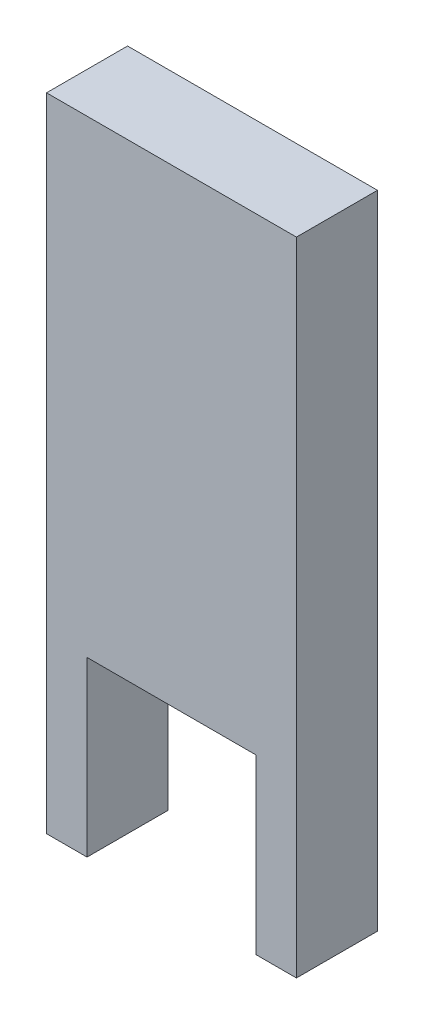
ISO-10303-21;
HEADER;
FILE_DESCRIPTION(('STEP AP214'),'2;1');
FILE_NAME('part.step','',(''),(''),'','','');
FILE_SCHEMA(('AUTOMOTIVE_DESIGN { 1 0 10303 214 1 1 1 1 }'));
ENDSEC;
DATA;
#1=APPLICATION_CONTEXT('core data for automotive mechanical design processes');
#2=APPLICATION_PROTOCOL_DEFINITION('international standard','automotive_design',2000,#1);
#3=PRODUCT_CONTEXT('',#1,'mechanical');
#4=PRODUCT('Part','Part','',(#3));
#5=PRODUCT_RELATED_PRODUCT_CATEGORY('part','',(#4));
#6=PRODUCT_DEFINITION_FORMATION('','',#4);
#7=PRODUCT_DEFINITION_CONTEXT('part definition',#1,'design');
#8=PRODUCT_DEFINITION('design','',#6,#7);
#9=PRODUCT_DEFINITION_SHAPE('','',#8);
#10=(LENGTH_UNIT() NAMED_UNIT(*) SI_UNIT(.MILLI.,.METRE.));
#11=(NAMED_UNIT(*) PLANE_ANGLE_UNIT() SI_UNIT($,.RADIAN.));
#12=(NAMED_UNIT(*) SI_UNIT($,.STERADIAN.) SOLID_ANGLE_UNIT());
#13=UNCERTAINTY_MEASURE_WITH_UNIT(LENGTH_MEASURE(1.E-05),#10,'distance_accuracy_value','');
#14=(GEOMETRIC_REPRESENTATION_CONTEXT(3) GLOBAL_UNCERTAINTY_ASSIGNED_CONTEXT((#13)) GLOBAL_UNIT_ASSIGNED_CONTEXT((#10,
#11,#12)) REPRESENTATION_CONTEXT('',''));
#15=CARTESIAN_POINT('',(0.,0.,0.));
#16=DIRECTION('',(0.,0.,1.));
#17=DIRECTION('',(1.,0.,0.));
#18=AXIS2_PLACEMENT_3D('',#15,#16,#17);
#19=CARTESIAN_POINT('',(-32.6951216622849,-23.8610871004323,2.25355338999986));
#20=DIRECTION('',(1.,0.,0.));
#21=DIRECTION('',(0.,-0.868514733325434,-0.495663351476232));
#22=AXIS2_PLACEMENT_3D('',#19,#20,#21);
#23=CYLINDRICAL_SURFACE('',#22,0.1);
#24=CARTESIAN_POINT('',(-32.6951216622849,-23.7896728161469,2.32355338999985));
#25=CARTESIAN_POINT('',(-32.6951216622849,-23.7777104068749,2.31137912783125));
#26=CARTESIAN_POINT('',(-32.6951216622849,-23.7689641964226,2.29608274833096));
#27=CARTESIAN_POINT('',(-32.6951216622849,-23.7645382938112,2.27959890119473));
#28=(BOUNDED_CURVE() B_SPLINE_CURVE(3,(#24,#25,#26,#27),.UNSPECIFIED.,.F.,
.F.) B_SPLINE_CURVE_WITH_KNOTS((4,4),(0.,0.996703266732082),
.UNSPECIFIED.) CURVE() GEOMETRIC_REPRESENTATION_ITEM() RATIONAL_B_SPLINE_CURVE((1.,1.,1.,1.)) REPRESENTATION_ITEM(''));
#29=CARTESIAN_POINT('',(-32.6951214956182,-23.7896729135874,2.32355330666029));
#30=VERTEX_POINT('',#29);
#31=CARTESIAN_POINT('',(-32.6951216622849,-23.7645372906601,2.27959442029426));
#32=VERTEX_POINT('',#31);
#33=EDGE_CURVE('E11',#30,#32,#28,.T.);
#34=ORIENTED_EDGE('',*,*,#33,.T.);
#35=CARTESIAN_POINT('',(-32.6951216622849,-23.7644945178032,2.27943529450943));
#36=CARTESIAN_POINT('',(-32.6117883289516,-23.7644945178032,2.27943529450943));
#37=CARTESIAN_POINT('',(-32.5284549956182,-23.7644945178032,2.27943529450943));
#38=CARTESIAN_POINT('',(-32.4451216622849,-23.7644945178032,2.27943529450943));
#39=(BOUNDED_CURVE() B_SPLINE_CURVE(3,(#35,#36,#37,#38),.UNSPECIFIED.,.F.,
.F.) B_SPLINE_CURVE_WITH_KNOTS((4,4),(-1.,0.),
.UNSPECIFIED.) CURVE() GEOMETRIC_REPRESENTATION_ITEM() RATIONAL_B_SPLINE_CURVE((1.,1.,1.,1.)) REPRESENTATION_ITEM(''));
#40=CARTESIAN_POINT('',(-32.4451216622849,-23.7645439761128,2.27961932737541));
#41=VERTEX_POINT('',#40);
#42=EDGE_CURVE('E47',#32,#41,#39,.T.);
#43=ORIENTED_EDGE('',*,*,#42,.T.);
#44=CARTESIAN_POINT('',(-32.4451216622849,-23.7645437937707,2.27961937637639));
#45=CARTESIAN_POINT('',(-32.4451216622849,-23.7689714398459,2.29609541496377));
#46=CARTESIAN_POINT('',(-32.4451216622849,-23.7777153600028,2.31138416867851));
#47=CARTESIAN_POINT('',(-32.4451216622849,-23.7896728161469,2.32355338999986));
#48=(BOUNDED_CURVE() B_SPLINE_CURVE(3,(#44,#45,#46,#47),.UNSPECIFIED.,.F.,
.F.) B_SPLINE_CURVE_WITH_KNOTS((4,4),(0.00370942595290715,1.),
.UNSPECIFIED.) CURVE() GEOMETRIC_REPRESENTATION_ITEM() RATIONAL_B_SPLINE_CURVE((1.,1.,1.,1.)) REPRESENTATION_ITEM(''));
#49=CARTESIAN_POINT('',(-32.4451218289516,-23.7896729344209,2.32355330666029));
#50=VERTEX_POINT('',#49);
#51=EDGE_CURVE('E305',#41,#50,#48,.T.);
#52=ORIENTED_EDGE('',*,*,#51,.T.);
#53=CARTESIAN_POINT('',(-32.4451218289516,-23.7896728161469,2.32355338999986));
#54=CARTESIAN_POINT('',(-32.5284550511738,-23.7896728161469,2.32355338999986));
#55=CARTESIAN_POINT('',(-32.611788273396,-23.7896728161469,2.32355338999986));
#56=CARTESIAN_POINT('',(-32.6951214956182,-23.7896728161469,2.32355338999986));
#57=(BOUNDED_CURVE() B_SPLINE_CURVE(3,(#53,#54,#55,#56),.UNSPECIFIED.,.F.,
.F.) B_SPLINE_CURVE_WITH_KNOTS((4,4),(-0.999999333333334,-6.66666666315763E-07),
.UNSPECIFIED.) CURVE() GEOMETRIC_REPRESENTATION_ITEM() RATIONAL_B_SPLINE_CURVE((1.,1.,1.,1.)) REPRESENTATION_ITEM(''));
#58=EDGE_CURVE('E219',#50,#30,#57,.T.);
#59=ORIENTED_EDGE('',*,*,#58,.T.);
#60=EDGE_LOOP('',(#34,#43,#52,#59));
#61=FACE_BOUND('',#60,.T.);
#62=ADVANCED_FACE('F17',(#61),#23,.F.);
#63=CARTESIAN_POINT('',(-32.6951216622849,-22.7947187344132,0.798999999999811));
#64=DIRECTION('',(-1.,0.,0.));
#65=DIRECTION('',(0.,0.,1.));
#66=AXIS2_PLACEMENT_3D('',#63,#64,#65);
#67=PLANE('',#66);
#68=CARTESIAN_POINT('',(-32.6951216622849,-24.0457187344132,2.32355322333319));
#69=CARTESIAN_POINT('',(-32.6951216622849,-24.0457187344132,2.2835533344443));
#70=CARTESIAN_POINT('',(-32.6951216622849,-24.0457187344132,2.24355344555542));
#71=CARTESIAN_POINT('',(-32.6951216622849,-24.0457187344132,2.20355355666653));
#72=(BOUNDED_CURVE() B_SPLINE_CURVE(3,(#68,#69,#70,#71),.UNSPECIFIED.,.F.,
.F.) B_SPLINE_CURVE_WITH_KNOTS((4,4),(-0.999998611111097,-1.38888890984188E-06),
.UNSPECIFIED.) CURVE() GEOMETRIC_REPRESENTATION_ITEM() RATIONAL_B_SPLINE_CURVE((1.,1.,1.,1.)) REPRESENTATION_ITEM(''));
#73=CARTESIAN_POINT('',(-32.6951218289516,-24.0457185677465,2.32355322333319));
#74=VERTEX_POINT('',#73);
#75=CARTESIAN_POINT('',(-32.6951218289516,-24.0457185677465,2.20355355666653));
#76=VERTEX_POINT('',#75);
#77=EDGE_CURVE('E270',#74,#76,#72,.T.);
#78=ORIENTED_EDGE('',*,*,#77,.T.);
#79=CARTESIAN_POINT('',(-32.6951216622849,-24.0457185677465,2.20355338999986));
#80=CARTESIAN_POINT('',(-32.6951216622849,-23.945199790589,2.20355338999986));
#81=CARTESIAN_POINT('',(-32.6951216622849,-23.8446810134315,2.20355338999986));
#82=CARTESIAN_POINT('',(-32.6951216622849,-23.744162236274,2.20355338999986));
#83=(BOUNDED_CURVE() B_SPLINE_CURVE(3,(#79,#80,#81,#82),.UNSPECIFIED.,.F.,
.F.) B_SPLINE_CURVE_WITH_KNOTS((4,4),(-0.999999447312362,-7.08005090614583E-07),
.UNSPECIFIED.) CURVE() GEOMETRIC_REPRESENTATION_ITEM() RATIONAL_B_SPLINE_CURVE((1.,1.,1.,1.)) REPRESENTATION_ITEM(''));
#84=CARTESIAN_POINT('',(-32.6951214956182,-23.744162236274,2.20355355382702));
#85=VERTEX_POINT('',#84);
#86=EDGE_CURVE('E168',#76,#85,#83,.T.);
#87=ORIENTED_EDGE('',*,*,#86,.T.);
#88=CARTESIAN_POINT('',(-32.6951216622849,-23.7441620780291,2.20355359622861));
#89=CARTESIAN_POINT('',(-32.6951216622849,-23.7509395579538,2.22884749565555));
#90=CARTESIAN_POINT('',(-32.6951216622849,-23.7577170378785,2.25414139508249));
#91=CARTESIAN_POINT('',(-32.6951216622849,-23.7644945178032,2.27943529450943));
#92=(BOUNDED_CURVE() B_SPLINE_CURVE(3,(#88,#89,#90,#91),.UNSPECIFIED.,.F.,
.F.) B_SPLINE_CURVE_WITH_KNOTS((4,4),(-0.999997282240848,0.),
.UNSPECIFIED.) CURVE() GEOMETRIC_REPRESENTATION_ITEM() RATIONAL_B_SPLINE_CURVE((1.,1.,1.,1.)) REPRESENTATION_ITEM(''));
#93=EDGE_CURVE('E29',#85,#32,#92,.T.);
#94=ORIENTED_EDGE('',*,*,#93,.T.);
#95=ORIENTED_EDGE('',*,*,#33,.F.);
#96=CARTESIAN_POINT('',(-32.6951216622849,-23.7896728161469,2.32355338999986));
#97=CARTESIAN_POINT('',(-32.6951216622849,-23.8750214000134,2.32355338999986));
#98=CARTESIAN_POINT('',(-32.6951216622849,-23.96036998388,2.32355338999986));
#99=CARTESIAN_POINT('',(-32.6951216622849,-24.0457185677465,2.32355338999986));
#100=(BOUNDED_CURVE() B_SPLINE_CURVE(3,(#96,#97,#98,#99),.UNSPECIFIED.,.F.,
.F.) B_SPLINE_CURVE_WITH_KNOTS((4,4),(-1.,-6.50924897526202E-07),
.UNSPECIFIED.) CURVE() GEOMETRIC_REPRESENTATION_ITEM() RATIONAL_B_SPLINE_CURVE((1.,1.,1.,1.)) REPRESENTATION_ITEM(''));
#101=EDGE_CURVE('E210',#30,#74,#100,.T.);
#102=ORIENTED_EDGE('',*,*,#101,.T.);
#103=EDGE_LOOP('',(#78,#87,#94,#95,#102));
#104=FACE_BOUND('',#103,.T.);
#105=ADVANCED_FACE('F19',(#104),#67,.F.);
#106=CARTESIAN_POINT('',(-32.6961216622849,-23.4080145852149,0.949034074173528));
#107=DIRECTION('',(0.,0.965925826290908,0.258819045095657));
#108=DIRECTION('',(1.,0.,0.));
#109=AXIS2_PLACEMENT_3D('',#106,#107,#108);
#110=PLANE('',#109);
#111=CARTESIAN_POINT('',(-32.4451216622849,-23.7441620780291,2.2035535962286));
#112=CARTESIAN_POINT('',(-32.4451216622849,-23.7509395579538,2.22884749565549));
#113=CARTESIAN_POINT('',(-32.4451216622849,-23.7577170378785,2.25414139508237));
#114=CARTESIAN_POINT('',(-32.4451216622849,-23.7644945178032,2.27943529450926));
#115=(BOUNDED_CURVE() B_SPLINE_CURVE(3,(#111,#112,#113,#114),.UNSPECIFIED.,.F.,
.F.) B_SPLINE_CURVE_WITH_KNOTS((4,4),(2.71775914691567E-06,1.),
.UNSPECIFIED.) CURVE() GEOMETRIC_REPRESENTATION_ITEM() RATIONAL_B_SPLINE_CURVE((1.,1.,1.,1.)) REPRESENTATION_ITEM(''));
#116=CARTESIAN_POINT('',(-32.4451218289516,-23.744162236274,2.20355355382702));
#117=VERTEX_POINT('',#116);
#118=EDGE_CURVE('E271',#117,#41,#115,.T.);
#119=ORIENTED_EDGE('',*,*,#118,.T.);
#120=ORIENTED_EDGE('',*,*,#42,.F.);
#121=ORIENTED_EDGE('',*,*,#93,.F.);
#122=CARTESIAN_POINT('',(-32.6951214956182,-23.7441620227703,2.20355338999986));
#123=CARTESIAN_POINT('',(-32.611788273396,-23.7441620227703,2.20355338999986));
#124=CARTESIAN_POINT('',(-32.5284550511738,-23.7441620227703,2.20355338999986));
#125=CARTESIAN_POINT('',(-32.4451218289516,-23.7441620227703,2.20355338999986));
#126=(BOUNDED_CURVE() B_SPLINE_CURVE(3,(#122,#123,#124,#125),.UNSPECIFIED.,.F.,
.F.) B_SPLINE_CURVE_WITH_KNOTS((4,4),(-0.999999333333334,-6.66666666315763E-07),
.UNSPECIFIED.) CURVE() GEOMETRIC_REPRESENTATION_ITEM() RATIONAL_B_SPLINE_CURVE((1.,1.,1.,1.)) REPRESENTATION_ITEM(''));
#127=EDGE_CURVE('E178',#85,#117,#126,.T.);
#128=ORIENTED_EDGE('',*,*,#127,.T.);
#129=EDGE_LOOP('',(#119,#120,#121,#128));
#130=FACE_BOUND('',#129,.T.);
#131=ADVANCED_FACE('F367',(#130),#110,.F.);
#132=CARTESIAN_POINT('',(-32.7551216622849,-26.9800217622114,2.20255338999987));
#133=DIRECTION('',(1.,0.,0.));
#134=DIRECTION('',(0.,1.,0.));
#135=AXIS2_PLACEMENT_3D('',#132,#133,#134);
#136=PLANE('',#135);
#137=CARTESIAN_POINT('',(-32.7551216622849,-24.0457185677465,2.32355338999986));
#138=CARTESIAN_POINT('',(-32.7551216622849,-23.729052012191,2.32355338999986));
#139=CARTESIAN_POINT('',(-32.7551216622849,-23.4123854566354,2.32355338999986));
#140=CARTESIAN_POINT('',(-32.7551216622849,-23.0957189010799,2.32355338999986));
#141=(BOUNDED_CURVE() B_SPLINE_CURVE(3,(#137,#138,#139,#140),.UNSPECIFIED.,.F.,
.F.) B_SPLINE_CURVE_WITH_KNOTS((4,4),(-0.9999998245614,-1.75438600050934E-07),
.UNSPECIFIED.) CURVE() GEOMETRIC_REPRESENTATION_ITEM() RATIONAL_B_SPLINE_CURVE((1.,1.,1.,1.)) REPRESENTATION_ITEM(''));
#142=CARTESIAN_POINT('',(-32.7551214956182,-24.0457185677465,2.3235532233332));
#143=VERTEX_POINT('',#142);
#144=CARTESIAN_POINT('',(-32.7551214956182,-23.0957189010799,2.32355322333319));
#145=VERTEX_POINT('',#144);
#146=EDGE_CURVE('E288',#143,#145,#141,.T.);
#147=ORIENTED_EDGE('',*,*,#146,.T.);
#148=CARTESIAN_POINT('',(-32.7551216622849,-23.0957187344132,2.32355322333319));
#149=CARTESIAN_POINT('',(-32.7551216622849,-23.0957187344132,2.2835533344443));
#150=CARTESIAN_POINT('',(-32.7551216622849,-23.0957187344132,2.24355344555542));
#151=CARTESIAN_POINT('',(-32.7551216622849,-23.0957187344132,2.20355355666653));
#152=(BOUNDED_CURVE() B_SPLINE_CURVE(3,(#148,#149,#150,#151),.UNSPECIFIED.,.F.,
.F.) B_SPLINE_CURVE_WITH_KNOTS((4,4),(-0.999998611111108,-1.38888889177185E-06),
.UNSPECIFIED.) CURVE() GEOMETRIC_REPRESENTATION_ITEM() RATIONAL_B_SPLINE_CURVE((1.,1.,1.,1.)) REPRESENTATION_ITEM(''));
#153=CARTESIAN_POINT('',(-32.7551214956182,-23.0957189010799,2.20355355666653));
#154=VERTEX_POINT('',#153);
#155=EDGE_CURVE('E247',#145,#154,#152,.T.);
#156=ORIENTED_EDGE('',*,*,#155,.T.);
#157=CARTESIAN_POINT('',(-32.7551216622849,-23.0957189010799,2.20355338999986));
#158=CARTESIAN_POINT('',(-32.7551216622849,-23.4123854566354,2.20355338999986));
#159=CARTESIAN_POINT('',(-32.7551216622849,-23.729052012191,2.20355338999986));
#160=CARTESIAN_POINT('',(-32.7551216622849,-24.0457185677465,2.20355338999986));
#161=(BOUNDED_CURVE() B_SPLINE_CURVE(3,(#157,#158,#159,#160),.UNSPECIFIED.,.F.,
.F.) B_SPLINE_CURVE_WITH_KNOTS((4,4),(-0.999999824561404,-1.75438596398885E-07),
.UNSPECIFIED.) CURVE() GEOMETRIC_REPRESENTATION_ITEM() RATIONAL_B_SPLINE_CURVE((1.,1.,1.,1.)) REPRESENTATION_ITEM(''));
#162=CARTESIAN_POINT('',(-32.7551214956182,-24.0457185677465,2.20355355666653));
#163=VERTEX_POINT('',#162);
#164=EDGE_CURVE('E122',#154,#163,#161,.T.);
#165=ORIENTED_EDGE('',*,*,#164,.T.);
#166=CARTESIAN_POINT('',(-32.7551216622849,-24.0457187344132,2.20355355666653));
#167=CARTESIAN_POINT('',(-32.7551216622849,-24.0457187344132,2.24355344555542));
#168=CARTESIAN_POINT('',(-32.7551216622849,-24.0457187344132,2.28355333444431));
#169=CARTESIAN_POINT('',(-32.7551216622849,-24.0457187344132,2.3235532233332));
#170=(BOUNDED_CURVE() B_SPLINE_CURVE(3,(#166,#167,#168,#169),.UNSPECIFIED.,.F.,
.F.) B_SPLINE_CURVE_WITH_KNOTS((4,4),(-0.999998611111083,-1.38888887370181E-06),
.UNSPECIFIED.) CURVE() GEOMETRIC_REPRESENTATION_ITEM() RATIONAL_B_SPLINE_CURVE((1.,1.,1.,1.)) REPRESENTATION_ITEM(''));
#171=EDGE_CURVE('E262',#163,#143,#170,.T.);
#172=ORIENTED_EDGE('',*,*,#171,.T.);
#173=EDGE_LOOP('',(#147,#156,#165,#172));
#174=FACE_BOUND('',#173,.T.);
#175=ADVANCED_FACE('F373',(#174),#136,.F.);
#176=CARTESIAN_POINT('',(-32.6941216622849,-24.0457187344132,2.20255338999986));
#177=DIRECTION('',(0.,1.,0.));
#178=DIRECTION('',(0.,0.,-1.));
#179=AXIS2_PLACEMENT_3D('',#176,#177,#178);
#180=PLANE('',#179);
#181=ORIENTED_EDGE('',*,*,#171,.F.);
#182=CARTESIAN_POINT('',(-32.7551214956182,-24.0457187344132,2.20355338999986));
#183=CARTESIAN_POINT('',(-32.7351216067293,-24.0457187344132,2.20355338999986));
#184=CARTESIAN_POINT('',(-32.7151217178405,-24.0457187344132,2.20355338999986));
#185=CARTESIAN_POINT('',(-32.6951218289516,-24.0457187344132,2.20355338999986));
#186=(BOUNDED_CURVE() B_SPLINE_CURVE(3,(#182,#183,#184,#185),.UNSPECIFIED.,.F.,
.F.) B_SPLINE_CURVE_WITH_KNOTS((4,4),(-0.999997222222224,-2.77777777631557E-06),
.UNSPECIFIED.) CURVE() GEOMETRIC_REPRESENTATION_ITEM() RATIONAL_B_SPLINE_CURVE((1.,1.,1.,1.)) REPRESENTATION_ITEM(''));
#187=EDGE_CURVE('E177',#163,#76,#186,.T.);
#188=ORIENTED_EDGE('',*,*,#187,.T.);
#189=ORIENTED_EDGE('',*,*,#77,.F.);
#190=CARTESIAN_POINT('',(-32.6951218289516,-24.0457187344132,2.32355338999986));
#191=CARTESIAN_POINT('',(-32.7151217178405,-24.0457187344132,2.32355338999986));
#192=CARTESIAN_POINT('',(-32.7351216067293,-24.0457187344132,2.32355338999986));
#193=CARTESIAN_POINT('',(-32.7551214956182,-24.0457187344132,2.32355338999986));
#194=(BOUNDED_CURVE() B_SPLINE_CURVE(3,(#190,#191,#192,#193),.UNSPECIFIED.,.F.,
.F.) B_SPLINE_CURVE_WITH_KNOTS((4,4),(-0.999997222222224,-2.77777777631557E-06),
.UNSPECIFIED.) CURVE() GEOMETRIC_REPRESENTATION_ITEM() RATIONAL_B_SPLINE_CURVE((1.,1.,1.,1.)) REPRESENTATION_ITEM(''));
#195=EDGE_CURVE('E296',#74,#143,#194,.T.);
#196=ORIENTED_EDGE('',*,*,#195,.T.);
#197=EDGE_LOOP('',(#181,#188,#189,#196));
#198=FACE_BOUND('',#197,.T.);
#199=ADVANCED_FACE('F375',(#198),#180,.F.);
#200=CARTESIAN_POINT('',(-32.4451216622849,-24.0467187344132,0.798999999999815));
#201=DIRECTION('',(1.,0.,0.));
#202=DIRECTION('',(0.,1.,0.));
#203=AXIS2_PLACEMENT_3D('',#200,#201,#202);
#204=PLANE('',#203);
#205=CARTESIAN_POINT('',(-32.4451216622849,-24.0457187344132,2.20355355666653));
#206=CARTESIAN_POINT('',(-32.4451216622849,-24.0457187344132,2.24355344555542));
#207=CARTESIAN_POINT('',(-32.4451216622849,-24.0457187344132,2.28355333444431));
#208=CARTESIAN_POINT('',(-32.4451216622849,-24.0457187344132,2.32355322333319));
#209=(BOUNDED_CURVE() B_SPLINE_CURVE(3,(#205,#206,#207,#208),.UNSPECIFIED.,.F.,
.F.) B_SPLINE_CURVE_WITH_KNOTS((4,4),(-0.999998611111101,-1.38888887731582E-06),
.UNSPECIFIED.) CURVE() GEOMETRIC_REPRESENTATION_ITEM() RATIONAL_B_SPLINE_CURVE((1.,1.,1.,1.)) REPRESENTATION_ITEM(''));
#210=CARTESIAN_POINT('',(-32.4451214956182,-24.0457185677465,2.20355355666653));
#211=VERTEX_POINT('',#210);
#212=CARTESIAN_POINT('',(-32.4451214956182,-24.0457185677465,2.32355322333319));
#213=VERTEX_POINT('',#212);
#214=EDGE_CURVE('E193',#211,#213,#209,.T.);
#215=ORIENTED_EDGE('',*,*,#214,.T.);
#216=CARTESIAN_POINT('',(-32.4451216622849,-24.0457185677465,2.32355338999986));
#217=CARTESIAN_POINT('',(-32.4451216622849,-23.9603700233046,2.32355338999986));
#218=CARTESIAN_POINT('',(-32.4451216622849,-23.8750214788628,2.32355338999986));
#219=CARTESIAN_POINT('',(-32.4451216622849,-23.7896729344209,2.32355338999986));
#220=(BOUNDED_CURVE() B_SPLINE_CURVE(3,(#216,#217,#218,#219),.UNSPECIFIED.,.F.,
.F.) B_SPLINE_CURVE_WITH_KNOTS((4,4),(-0.999999349075075,-4.61924950942406E-07),
.UNSPECIFIED.) CURVE() GEOMETRIC_REPRESENTATION_ITEM() RATIONAL_B_SPLINE_CURVE((1.,1.,1.,1.)) REPRESENTATION_ITEM(''));
#221=EDGE_CURVE('E279',#213,#50,#220,.T.);
#222=ORIENTED_EDGE('',*,*,#221,.T.);
#223=ORIENTED_EDGE('',*,*,#51,.F.);
#224=ORIENTED_EDGE('',*,*,#118,.F.);
#225=CARTESIAN_POINT('',(-32.4451216622849,-23.744162236274,2.20355338999986));
#226=CARTESIAN_POINT('',(-32.4451216622849,-23.8446810134315,2.20355338999986));
#227=CARTESIAN_POINT('',(-32.4451216622849,-23.945199790589,2.20355338999986));
#228=CARTESIAN_POINT('',(-32.4451216622849,-24.0457185677465,2.20355338999986));
#229=(BOUNDED_CURVE() B_SPLINE_CURVE(3,(#225,#226,#227,#228),.UNSPECIFIED.,.F.,
.F.) B_SPLINE_CURVE_WITH_KNOTS((4,4),(-0.999999291994909,-5.5268763766169E-07),
.UNSPECIFIED.) CURVE() GEOMETRIC_REPRESENTATION_ITEM() RATIONAL_B_SPLINE_CURVE((1.,1.,1.,1.)) REPRESENTATION_ITEM(''));
#230=EDGE_CURVE('E126',#117,#211,#229,.T.);
#231=ORIENTED_EDGE('',*,*,#230,.T.);
#232=EDGE_LOOP('',(#215,#222,#223,#224,#231));
#233=FACE_BOUND('',#232,.T.);
#234=ADVANCED_FACE('F356',(#233),#204,.F.);
#235=CARTESIAN_POINT('',(-32.7561216622849,-26.9800217622114,2.32355338999987));
#236=DIRECTION('',(0.,0.,-1.));
#237=DIRECTION('',(0.,-1.,0.));
#238=AXIS2_PLACEMENT_3D('',#235,#236,#237);
#239=PLANE('',#238);
#240=ORIENTED_EDGE('',*,*,#101,.F.);
#241=ORIENTED_EDGE('',*,*,#58,.F.);
#242=ORIENTED_EDGE('',*,*,#221,.F.);
#243=CARTESIAN_POINT('',(-32.4451214956182,-24.0457187344132,2.32355338999986));
#244=CARTESIAN_POINT('',(-32.4251216067293,-24.0457187344132,2.32355338999986));
#245=CARTESIAN_POINT('',(-32.4051217178405,-24.0457187344132,2.32355338999986));
#246=CARTESIAN_POINT('',(-32.3851218289516,-24.0457187344132,2.32355338999986));
#247=(BOUNDED_CURVE() B_SPLINE_CURVE(3,(#243,#244,#245,#246),.UNSPECIFIED.,.F.,
.F.) B_SPLINE_CURVE_WITH_KNOTS((4,4),(-0.999997222222224,-2.77777766066745E-06),
.UNSPECIFIED.) CURVE() GEOMETRIC_REPRESENTATION_ITEM() RATIONAL_B_SPLINE_CURVE((1.,1.,1.,1.)) REPRESENTATION_ITEM(''));
#248=CARTESIAN_POINT('',(-32.3851218289516,-24.0457185677465,2.3235532233332));
#249=VERTEX_POINT('',#248);
#250=EDGE_CURVE('E167',#213,#249,#247,.T.);
#251=ORIENTED_EDGE('',*,*,#250,.T.);
#252=CARTESIAN_POINT('',(-32.3851216622849,-24.0457185677465,2.32355338999987));
#253=CARTESIAN_POINT('',(-32.3851216622849,-23.729052012191,2.32355338999987));
#254=CARTESIAN_POINT('',(-32.3851216622849,-23.4123854566354,2.32355338999987));
#255=CARTESIAN_POINT('',(-32.3851216622849,-23.0957189010799,2.32355338999986));
#256=(BOUNDED_CURVE() B_SPLINE_CURVE(3,(#252,#253,#254,#255),.UNSPECIFIED.,.F.,
.F.) B_SPLINE_CURVE_WITH_KNOTS((4,4),(-0.999999824561404,-1.75438596398885E-07),
.UNSPECIFIED.) CURVE() GEOMETRIC_REPRESENTATION_ITEM() RATIONAL_B_SPLINE_CURVE((1.,1.,1.,1.)) REPRESENTATION_ITEM(''));
#257=CARTESIAN_POINT('',(-32.3851218289516,-23.0957189010799,2.32355322333319));
#258=VERTEX_POINT('',#257);
#259=EDGE_CURVE('E137',#249,#258,#256,.T.);
#260=ORIENTED_EDGE('',*,*,#259,.T.);
#261=CARTESIAN_POINT('',(-32.3851218289516,-23.0957187344132,2.32355338999986));
#262=CARTESIAN_POINT('',(-32.5084550511738,-23.0957187344132,2.32355338999986));
#263=CARTESIAN_POINT('',(-32.631788273396,-23.0957187344132,2.32355338999986));
#264=CARTESIAN_POINT('',(-32.7551214956182,-23.0957187344132,2.32355338999986));
#265=(BOUNDED_CURVE() B_SPLINE_CURVE(3,(#261,#262,#263,#264),.UNSPECIFIED.,.F.,
.F.) B_SPLINE_CURVE_WITH_KNOTS((4,4),(-0.99999954954955,-4.50450450213353E-07),
.UNSPECIFIED.) CURVE() GEOMETRIC_REPRESENTATION_ITEM() RATIONAL_B_SPLINE_CURVE((1.,1.,1.,1.)) REPRESENTATION_ITEM(''));
#266=EDGE_CURVE('E132',#258,#145,#265,.T.);
#267=ORIENTED_EDGE('',*,*,#266,.T.);
#268=ORIENTED_EDGE('',*,*,#146,.F.);
#269=ORIENTED_EDGE('',*,*,#195,.F.);
#270=EDGE_LOOP('',(#240,#241,#242,#251,#260,#267,#268,#269));
#271=FACE_BOUND('',#270,.T.);
#272=ADVANCED_FACE('F360',(#271),#239,.F.);
#273=CARTESIAN_POINT('',(-34.9211216622868,-23.0957187344132,2.97999999999988));
#274=DIRECTION('',(0.,-1.,0.));
#275=DIRECTION('',(-1.,0.,0.));
#276=AXIS2_PLACEMENT_3D('',#273,#274,#275);
#277=PLANE('',#276);
#278=ORIENTED_EDGE('',*,*,#155,.F.);
#279=ORIENTED_EDGE('',*,*,#266,.F.);
#280=CARTESIAN_POINT('',(-32.3851216622849,-23.0957187344132,2.32355322333319));
#281=CARTESIAN_POINT('',(-32.3851216622849,-23.0957187344132,2.2835533344443));
#282=CARTESIAN_POINT('',(-32.3851216622849,-23.0957187344132,2.24355344555542));
#283=CARTESIAN_POINT('',(-32.3851216622849,-23.0957187344132,2.20355355666653));
#284=(BOUNDED_CURVE() B_SPLINE_CURVE(3,(#280,#281,#282,#283),.UNSPECIFIED.,.F.,
.F.) B_SPLINE_CURVE_WITH_KNOTS((4,4),(-0.999998611111079,-1.3888888700878E-06),
.UNSPECIFIED.) CURVE() GEOMETRIC_REPRESENTATION_ITEM() RATIONAL_B_SPLINE_CURVE((1.,1.,1.,1.)) REPRESENTATION_ITEM(''));
#285=CARTESIAN_POINT('',(-32.3851218289516,-23.0957189010799,2.20355355666653));
#286=VERTEX_POINT('',#285);
#287=EDGE_CURVE('E129',#258,#286,#284,.T.);
#288=ORIENTED_EDGE('',*,*,#287,.T.);
#289=CARTESIAN_POINT('',(-32.3851218289516,-23.0957187344132,2.20355338999986));
#290=CARTESIAN_POINT('',(-32.5084550511738,-23.0957187344132,2.20355338999986));
#291=CARTESIAN_POINT('',(-32.631788273396,-23.0957187344132,2.20355338999986));
#292=CARTESIAN_POINT('',(-32.7551214956182,-23.0957187344132,2.20355338999986));
#293=(BOUNDED_CURVE() B_SPLINE_CURVE(3,(#289,#290,#291,#292),.UNSPECIFIED.,.F.,
.F.) B_SPLINE_CURVE_WITH_KNOTS((4,4),(-0.99999954954955,-4.50450450213356E-07),
.UNSPECIFIED.) CURVE() GEOMETRIC_REPRESENTATION_ITEM() RATIONAL_B_SPLINE_CURVE((1.,1.,1.,1.)) REPRESENTATION_ITEM(''));
#294=EDGE_CURVE('E114',#286,#154,#293,.T.);
#295=ORIENTED_EDGE('',*,*,#294,.T.);
#296=EDGE_LOOP('',(#278,#279,#288,#295));
#297=FACE_BOUND('',#296,.T.);
#298=ADVANCED_FACE('F130',(#297),#277,.F.);
#299=CARTESIAN_POINT('',(-32.7561216622849,-23.0947187344132,2.20355338999986));
#300=DIRECTION('',(0.,0.,1.));
#301=DIRECTION('',(0.,-1.,0.));
#302=AXIS2_PLACEMENT_3D('',#299,#300,#301);
#303=PLANE('',#302);
#304=ORIENTED_EDGE('',*,*,#164,.F.);
#305=ORIENTED_EDGE('',*,*,#294,.F.);
#306=CARTESIAN_POINT('',(-32.3851216622849,-23.0957189010799,2.20355338999986));
#307=CARTESIAN_POINT('',(-32.3851216622849,-23.4123854566354,2.20355338999987));
#308=CARTESIAN_POINT('',(-32.3851216622849,-23.729052012191,2.20355338999987));
#309=CARTESIAN_POINT('',(-32.3851216622849,-24.0457185677465,2.20355338999987));
#310=(BOUNDED_CURVE() B_SPLINE_CURVE(3,(#306,#307,#308,#309),.UNSPECIFIED.,.F.,
.F.) B_SPLINE_CURVE_WITH_KNOTS((4,4),(-0.999999824561404,-1.75438596398885E-07),
.UNSPECIFIED.) CURVE() GEOMETRIC_REPRESENTATION_ITEM() RATIONAL_B_SPLINE_CURVE((1.,1.,1.,1.)) REPRESENTATION_ITEM(''));
#311=CARTESIAN_POINT('',(-32.3851218289516,-24.0457185677465,2.20355355666653));
#312=VERTEX_POINT('',#311);
#313=EDGE_CURVE('E119',#286,#312,#310,.T.);
#314=ORIENTED_EDGE('',*,*,#313,.T.);
#315=CARTESIAN_POINT('',(-32.3851218289516,-24.0457187344132,2.20355338999986));
#316=CARTESIAN_POINT('',(-32.4051217178405,-24.0457187344132,2.20355338999986));
#317=CARTESIAN_POINT('',(-32.4251216067293,-24.0457187344132,2.20355338999986));
#318=CARTESIAN_POINT('',(-32.4451214956182,-24.0457187344132,2.20355338999986));
#319=(BOUNDED_CURVE() B_SPLINE_CURVE(3,(#315,#316,#317,#318),.UNSPECIFIED.,.F.,
.F.) B_SPLINE_CURVE_WITH_KNOTS((4,4),(-0.999997222222224,-2.77777777631568E-06),
.UNSPECIFIED.) CURVE() GEOMETRIC_REPRESENTATION_ITEM() RATIONAL_B_SPLINE_CURVE((1.,1.,1.,1.)) REPRESENTATION_ITEM(''));
#320=EDGE_CURVE('E151',#312,#211,#319,.T.);
#321=ORIENTED_EDGE('',*,*,#320,.T.);
#322=ORIENTED_EDGE('',*,*,#230,.F.);
#323=ORIENTED_EDGE('',*,*,#127,.F.);
#324=ORIENTED_EDGE('',*,*,#86,.F.);
#325=ORIENTED_EDGE('',*,*,#187,.F.);
#326=EDGE_LOOP('',(#304,#305,#314,#321,#322,#323,#324,#325));
#327=FACE_BOUND('',#326,.T.);
#328=ADVANCED_FACE('F116',(#327),#303,.F.);
#329=CARTESIAN_POINT('',(-32.0441216622849,-24.0457187344132,2.20255338999986));
#330=DIRECTION('',(0.,1.,0.));
#331=DIRECTION('',(0.,0.,-1.));
#332=AXIS2_PLACEMENT_3D('',#329,#330,#331);
#333=PLANE('',#332);
#334=ORIENTED_EDGE('',*,*,#214,.F.);
#335=ORIENTED_EDGE('',*,*,#320,.F.);
#336=CARTESIAN_POINT('',(-32.3851216622849,-24.0457187344132,2.20355355666653));
#337=CARTESIAN_POINT('',(-32.3851216622849,-24.0457187344132,2.24355344555542));
#338=CARTESIAN_POINT('',(-32.3851216622849,-24.0457187344132,2.28355333444431));
#339=CARTESIAN_POINT('',(-32.3851216622849,-24.0457187344132,2.3235532233332));
#340=(BOUNDED_CURVE() B_SPLINE_CURVE(3,(#336,#337,#338,#339),.UNSPECIFIED.,.F.,
.F.) B_SPLINE_CURVE_WITH_KNOTS((4,4),(-0.999998611111144,-1.38888893152592E-06),
.UNSPECIFIED.) CURVE() GEOMETRIC_REPRESENTATION_ITEM() RATIONAL_B_SPLINE_CURVE((1.,1.,1.,1.)) REPRESENTATION_ITEM(''));
#341=EDGE_CURVE('E142',#312,#249,#340,.T.);
#342=ORIENTED_EDGE('',*,*,#341,.T.);
#343=ORIENTED_EDGE('',*,*,#250,.F.);
#344=EDGE_LOOP('',(#334,#335,#342,#343));
#345=FACE_BOUND('',#344,.T.);
#346=ADVANCED_FACE('F371',(#345),#333,.F.);
#347=CARTESIAN_POINT('',(-32.3851216622849,-23.0947187344132,2.20255338999986));
#348=DIRECTION('',(-1.,0.,0.));
#349=DIRECTION('',(0.,0.,1.));
#350=AXIS2_PLACEMENT_3D('',#347,#348,#349);
#351=PLANE('',#350);
#352=ORIENTED_EDGE('',*,*,#313,.F.);
#353=ORIENTED_EDGE('',*,*,#287,.F.);
#354=ORIENTED_EDGE('',*,*,#259,.F.);
#355=ORIENTED_EDGE('',*,*,#341,.F.);
#356=EDGE_LOOP('',(#352,#353,#354,#355));
#357=FACE_BOUND('',#356,.T.);
#358=ADVANCED_FACE('F140',(#357),#351,.F.);
#359=CLOSED_SHELL('',(#62,#105,#131,#175,#199,#234,#272,#298,#328,#346,#358));
#360=MANIFOLD_SOLID_BREP('B1',#359);
#361=ADVANCED_BREP_SHAPE_REPRESENTATION('',(#18,#360),#14);
#362=SHAPE_DEFINITION_REPRESENTATION(#9,#361);
ENDSEC;
END-ISO-10303-21;
